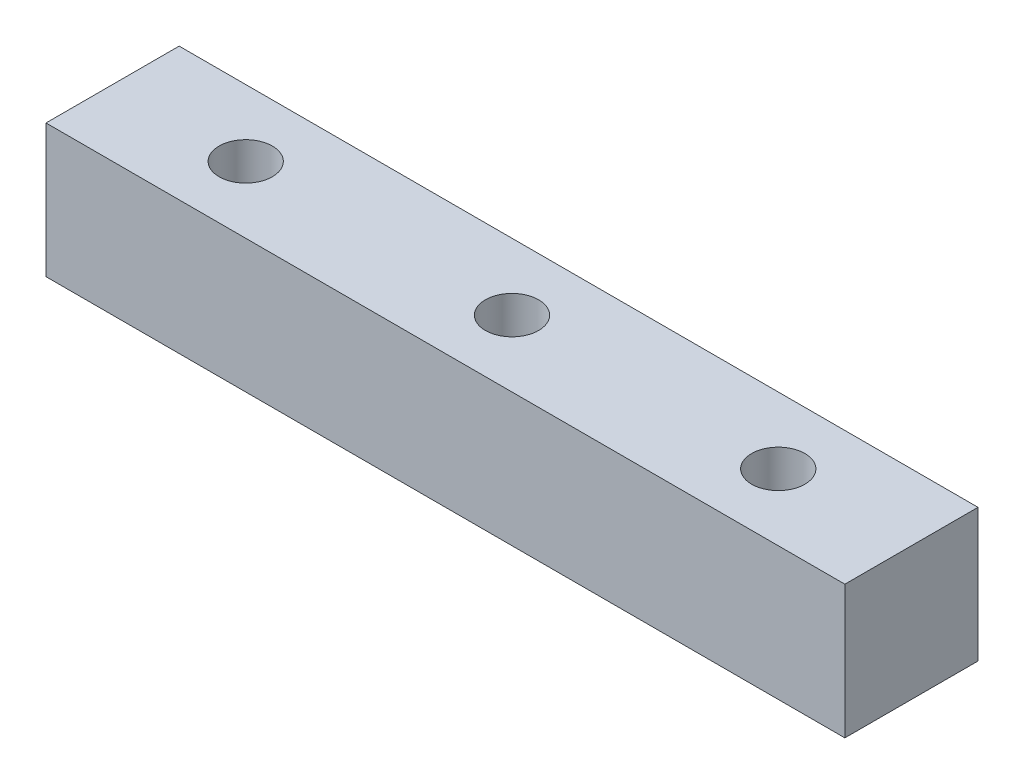
ISO-10303-21;
HEADER;
FILE_DESCRIPTION(('STEP AP214'),'2;1');
FILE_NAME('part.step','',(''),(''),'','','');
FILE_SCHEMA(('AUTOMOTIVE_DESIGN { 1 0 10303 214 1 1 1 1 }'));
ENDSEC;
DATA;
#1=APPLICATION_CONTEXT('core data for automotive mechanical design processes');
#2=APPLICATION_PROTOCOL_DEFINITION('international standard','automotive_design',2000,#1);
#3=PRODUCT_CONTEXT('',#1,'mechanical');
#4=PRODUCT('Part','Part','',(#3));
#5=PRODUCT_RELATED_PRODUCT_CATEGORY('part','',(#4));
#6=PRODUCT_DEFINITION_FORMATION('','',#4);
#7=PRODUCT_DEFINITION_CONTEXT('part definition',#1,'design');
#8=PRODUCT_DEFINITION('design','',#6,#7);
#9=PRODUCT_DEFINITION_SHAPE('','',#8);
#10=(LENGTH_UNIT() NAMED_UNIT(*) SI_UNIT(.MILLI.,.METRE.));
#11=(NAMED_UNIT(*) PLANE_ANGLE_UNIT() SI_UNIT($,.RADIAN.));
#12=(NAMED_UNIT(*) SI_UNIT($,.STERADIAN.) SOLID_ANGLE_UNIT());
#13=UNCERTAINTY_MEASURE_WITH_UNIT(LENGTH_MEASURE(1.E-05),#10,'distance_accuracy_value','');
#14=(GEOMETRIC_REPRESENTATION_CONTEXT(3) GLOBAL_UNCERTAINTY_ASSIGNED_CONTEXT((#13)) GLOBAL_UNIT_ASSIGNED_CONTEXT((#10,
#11,#12)) REPRESENTATION_CONTEXT('',''));
#15=CARTESIAN_POINT('',(0.,0.,0.));
#16=DIRECTION('',(0.,0.,1.));
#17=DIRECTION('',(1.,0.,0.));
#18=AXIS2_PLACEMENT_3D('',#15,#16,#17);
#19=CARTESIAN_POINT('',(0.,10.,0.));
#20=DIRECTION('',(0.,-1.,0.));
#21=DIRECTION('',(0.,0.,-1.));
#22=AXIS2_PLACEMENT_3D('',#19,#20,#21);
#23=PLANE('',#22);
#24=DIRECTION('',(0.,0.,1.));
#25=VECTOR('',#24,1.);
#26=CARTESIAN_POINT('',(0.,10.,0.));
#27=LINE('',#26,#25);
#28=CARTESIAN_POINT('',(0.,10.,-10.));
#29=VERTEX_POINT('',#28);
#30=CARTESIAN_POINT('',(0.,10.,0.));
#31=VERTEX_POINT('',#30);
#32=EDGE_CURVE('E85',#29,#31,#27,.T.);
#33=ORIENTED_EDGE('',*,*,#32,.T.);
#34=DIRECTION('',(1.,0.,0.));
#35=VECTOR('',#34,1.);
#36=CARTESIAN_POINT('',(0.,10.,0.));
#37=LINE('',#36,#35);
#38=CARTESIAN_POINT('',(60.,10.,0.));
#39=VERTEX_POINT('',#38);
#40=EDGE_CURVE('E80',#31,#39,#37,.T.);
#41=ORIENTED_EDGE('',*,*,#40,.T.);
#42=DIRECTION('',(0.,0.,-1.));
#43=VECTOR('',#42,1.);
#44=CARTESIAN_POINT('',(60.,10.,0.));
#45=LINE('',#44,#43);
#46=CARTESIAN_POINT('',(60.,10.,-10.));
#47=VERTEX_POINT('',#46);
#48=EDGE_CURVE('E83',#39,#47,#45,.T.);
#49=ORIENTED_EDGE('',*,*,#48,.T.);
#50=DIRECTION('',(-1.,0.,0.));
#51=VECTOR('',#50,1.);
#52=CARTESIAN_POINT('',(0.,10.,-10.));
#53=LINE('',#52,#51);
#54=EDGE_CURVE('E50',#47,#29,#53,.T.);
#55=ORIENTED_EDGE('',*,*,#54,.T.);
#56=EDGE_LOOP('',(#33,#41,#49,#55));
#57=FACE_BOUND('',#56,.T.);
#58=CARTESIAN_POINT('',(10.,10.,-5.));
#59=DIRECTION('',(0.,1.,0.));
#60=DIRECTION('',(0.,0.,1.));
#61=AXIS2_PLACEMENT_3D('',#58,#59,#60);
#62=CIRCLE('',#61,2.);
#63=CARTESIAN_POINT('',(10.,10.,-3.));
#64=VERTEX_POINT('',#63);
#65=EDGE_CURVE('E100',#64,#64,#62,.T.);
#66=ORIENTED_EDGE('',*,*,#65,.F.);
#67=EDGE_LOOP('',(#66));
#68=FACE_BOUND('',#67,.T.);
#69=CARTESIAN_POINT('',(30.,10.,-5.));
#70=DIRECTION('',(0.,1.,0.));
#71=DIRECTION('',(0.,0.,1.));
#72=AXIS2_PLACEMENT_3D('',#69,#70,#71);
#73=CIRCLE('',#72,2.);
#74=CARTESIAN_POINT('',(30.,10.,-3.));
#75=VERTEX_POINT('',#74);
#76=EDGE_CURVE('E115',#75,#75,#73,.T.);
#77=ORIENTED_EDGE('',*,*,#76,.F.);
#78=EDGE_LOOP('',(#77));
#79=FACE_BOUND('',#78,.T.);
#80=CARTESIAN_POINT('',(50.,10.,-5.));
#81=DIRECTION('',(0.,1.,0.));
#82=DIRECTION('',(0.,0.,1.));
#83=AXIS2_PLACEMENT_3D('',#80,#81,#82);
#84=CIRCLE('',#83,2.);
#85=CARTESIAN_POINT('',(50.,10.,-3.));
#86=VERTEX_POINT('',#85);
#87=EDGE_CURVE('E121',#86,#86,#84,.T.);
#88=ORIENTED_EDGE('',*,*,#87,.F.);
#89=EDGE_LOOP('',(#88));
#90=FACE_BOUND('',#89,.T.);
#91=ADVANCED_FACE('F33',(#57,#68,#79,#90),#23,.F.);
#92=CARTESIAN_POINT('',(0.,0.,0.));
#93=DIRECTION('',(0.,-1.,0.));
#94=DIRECTION('',(0.,0.,-1.));
#95=AXIS2_PLACEMENT_3D('',#92,#93,#94);
#96=PLANE('',#95);
#97=CARTESIAN_POINT('',(30.,0.,-5.));
#98=DIRECTION('',(0.,1.,0.));
#99=DIRECTION('',(0.,0.,1.));
#100=AXIS2_PLACEMENT_3D('',#97,#98,#99);
#101=CIRCLE('',#100,2.);
#102=CARTESIAN_POINT('',(30.,0.,-3.));
#103=VERTEX_POINT('',#102);
#104=EDGE_CURVE('E118',#103,#103,#101,.T.);
#105=ORIENTED_EDGE('',*,*,#104,.T.);
#106=EDGE_LOOP('',(#105));
#107=FACE_BOUND('',#106,.T.);
#108=DIRECTION('',(0.,0.,1.));
#109=VECTOR('',#108,1.);
#110=CARTESIAN_POINT('',(0.,0.,0.));
#111=LINE('',#110,#109);
#112=CARTESIAN_POINT('',(0.,0.,-10.));
#113=VERTEX_POINT('',#112);
#114=CARTESIAN_POINT('',(0.,0.,0.));
#115=VERTEX_POINT('',#114);
#116=EDGE_CURVE('E97',#113,#115,#111,.T.);
#117=ORIENTED_EDGE('',*,*,#116,.F.);
#118=DIRECTION('',(-1.,0.,0.));
#119=VECTOR('',#118,1.);
#120=CARTESIAN_POINT('',(0.,0.,-10.));
#121=LINE('',#120,#119);
#122=CARTESIAN_POINT('',(60.,0.,-10.));
#123=VERTEX_POINT('',#122);
#124=EDGE_CURVE('E73',#123,#113,#121,.T.);
#125=ORIENTED_EDGE('',*,*,#124,.F.);
#126=DIRECTION('',(0.,0.,-1.));
#127=VECTOR('',#126,1.);
#128=CARTESIAN_POINT('',(60.,0.,0.));
#129=LINE('',#128,#127);
#130=CARTESIAN_POINT('',(60.,0.,0.));
#131=VERTEX_POINT('',#130);
#132=EDGE_CURVE('E67',#131,#123,#129,.T.);
#133=ORIENTED_EDGE('',*,*,#132,.F.);
#134=DIRECTION('',(1.,0.,0.));
#135=VECTOR('',#134,1.);
#136=CARTESIAN_POINT('',(0.,0.,0.));
#137=LINE('',#136,#135);
#138=EDGE_CURVE('E89',#115,#131,#137,.T.);
#139=ORIENTED_EDGE('',*,*,#138,.F.);
#140=EDGE_LOOP('',(#117,#125,#133,#139));
#141=FACE_BOUND('',#140,.T.);
#142=CARTESIAN_POINT('',(10.,0.,-5.));
#143=DIRECTION('',(0.,1.,0.));
#144=DIRECTION('',(0.,0.,1.));
#145=AXIS2_PLACEMENT_3D('',#142,#143,#144);
#146=CIRCLE('',#145,2.);
#147=CARTESIAN_POINT('',(10.,0.,-3.));
#148=VERTEX_POINT('',#147);
#149=EDGE_CURVE('E112',#148,#148,#146,.T.);
#150=ORIENTED_EDGE('',*,*,#149,.T.);
#151=EDGE_LOOP('',(#150));
#152=FACE_BOUND('',#151,.T.);
#153=CARTESIAN_POINT('',(50.,0.,-5.));
#154=DIRECTION('',(0.,1.,0.));
#155=DIRECTION('',(0.,0.,1.));
#156=AXIS2_PLACEMENT_3D('',#153,#154,#155);
#157=CIRCLE('',#156,2.);
#158=CARTESIAN_POINT('',(50.,0.,-3.));
#159=VERTEX_POINT('',#158);
#160=EDGE_CURVE('E124',#159,#159,#157,.T.);
#161=ORIENTED_EDGE('',*,*,#160,.T.);
#162=EDGE_LOOP('',(#161));
#163=FACE_BOUND('',#162,.T.);
#164=ADVANCED_FACE('F108',(#107,#141,#152,#163),#96,.T.);
#165=CARTESIAN_POINT('',(0.,10.,0.));
#166=DIRECTION('',(1.,0.,0.));
#167=DIRECTION('',(0.,0.,-1.));
#168=AXIS2_PLACEMENT_3D('',#165,#166,#167);
#169=PLANE('',#168);
#170=ORIENTED_EDGE('',*,*,#116,.T.);
#171=DIRECTION('',(0.,-1.,0.));
#172=VECTOR('',#171,1.);
#173=CARTESIAN_POINT('',(0.,10.,0.));
#174=LINE('',#173,#172);
#175=EDGE_CURVE('E11',#31,#115,#174,.T.);
#176=ORIENTED_EDGE('',*,*,#175,.F.);
#177=ORIENTED_EDGE('',*,*,#32,.F.);
#178=DIRECTION('',(0.,-1.,0.));
#179=VECTOR('',#178,1.);
#180=CARTESIAN_POINT('',(0.,10.,-10.));
#181=LINE('',#180,#179);
#182=EDGE_CURVE('E93',#29,#113,#181,.T.);
#183=ORIENTED_EDGE('',*,*,#182,.T.);
#184=EDGE_LOOP('',(#170,#176,#177,#183));
#185=FACE_BOUND('',#184,.T.);
#186=ADVANCED_FACE('F35',(#185),#169,.F.);
#187=CARTESIAN_POINT('',(0.,10.,0.));
#188=DIRECTION('',(0.,0.,-1.));
#189=DIRECTION('',(-1.,0.,0.));
#190=AXIS2_PLACEMENT_3D('',#187,#188,#189);
#191=PLANE('',#190);
#192=ORIENTED_EDGE('',*,*,#138,.T.);
#193=DIRECTION('',(0.,-1.,0.));
#194=VECTOR('',#193,1.);
#195=CARTESIAN_POINT('',(60.,10.,0.));
#196=LINE('',#195,#194);
#197=EDGE_CURVE('E42',#39,#131,#196,.T.);
#198=ORIENTED_EDGE('',*,*,#197,.F.);
#199=ORIENTED_EDGE('',*,*,#40,.F.);
#200=ORIENTED_EDGE('',*,*,#175,.T.);
#201=EDGE_LOOP('',(#192,#198,#199,#200));
#202=FACE_BOUND('',#201,.T.);
#203=ADVANCED_FACE('F88',(#202),#191,.F.);
#204=CARTESIAN_POINT('',(60.,10.,0.));
#205=DIRECTION('',(-1.,0.,0.));
#206=DIRECTION('',(0.,0.,1.));
#207=AXIS2_PLACEMENT_3D('',#204,#205,#206);
#208=PLANE('',#207);
#209=ORIENTED_EDGE('',*,*,#132,.T.);
#210=DIRECTION('',(0.,-1.,0.));
#211=VECTOR('',#210,1.);
#212=CARTESIAN_POINT('',(60.,10.,-10.));
#213=LINE('',#212,#211);
#214=EDGE_CURVE('E90',#47,#123,#213,.T.);
#215=ORIENTED_EDGE('',*,*,#214,.F.);
#216=ORIENTED_EDGE('',*,*,#48,.F.);
#217=ORIENTED_EDGE('',*,*,#197,.T.);
#218=EDGE_LOOP('',(#209,#215,#216,#217));
#219=FACE_BOUND('',#218,.T.);
#220=ADVANCED_FACE('F91',(#219),#208,.F.);
#221=CARTESIAN_POINT('',(0.,10.,-10.));
#222=DIRECTION('',(0.,0.,1.));
#223=DIRECTION('',(1.,0.,0.));
#224=AXIS2_PLACEMENT_3D('',#221,#222,#223);
#225=PLANE('',#224);
#226=ORIENTED_EDGE('',*,*,#124,.T.);
#227=ORIENTED_EDGE('',*,*,#182,.F.);
#228=ORIENTED_EDGE('',*,*,#54,.F.);
#229=ORIENTED_EDGE('',*,*,#214,.T.);
#230=EDGE_LOOP('',(#226,#227,#228,#229));
#231=FACE_BOUND('',#230,.T.);
#232=ADVANCED_FACE('F105',(#231),#225,.F.);
#233=CARTESIAN_POINT('',(10.,10.,-5.));
#234=DIRECTION('',(0.,-1.,0.));
#235=DIRECTION('',(0.,0.,-1.));
#236=AXIS2_PLACEMENT_3D('',#233,#234,#235);
#237=CYLINDRICAL_SURFACE('',#236,2.);
#238=ORIENTED_EDGE('',*,*,#65,.T.);
#239=EDGE_LOOP('',(#238));
#240=FACE_BOUND('',#239,.T.);
#241=ORIENTED_EDGE('',*,*,#149,.F.);
#242=EDGE_LOOP('',(#241));
#243=FACE_BOUND('',#242,.T.);
#244=ADVANCED_FACE('F141',(#240,#243),#237,.F.);
#245=CARTESIAN_POINT('',(30.,10.,-5.));
#246=DIRECTION('',(0.,-1.,0.));
#247=DIRECTION('',(0.,0.,-1.));
#248=AXIS2_PLACEMENT_3D('',#245,#246,#247);
#249=CYLINDRICAL_SURFACE('',#248,2.);
#250=ORIENTED_EDGE('',*,*,#76,.T.);
#251=EDGE_LOOP('',(#250));
#252=FACE_BOUND('',#251,.T.);
#253=ORIENTED_EDGE('',*,*,#104,.F.);
#254=EDGE_LOOP('',(#253));
#255=FACE_BOUND('',#254,.T.);
#256=ADVANCED_FACE('F187',(#252,#255),#249,.F.);
#257=CARTESIAN_POINT('',(50.,10.,-5.));
#258=DIRECTION('',(0.,-1.,0.));
#259=DIRECTION('',(0.,0.,-1.));
#260=AXIS2_PLACEMENT_3D('',#257,#258,#259);
#261=CYLINDRICAL_SURFACE('',#260,2.);
#262=ORIENTED_EDGE('',*,*,#87,.T.);
#263=EDGE_LOOP('',(#262));
#264=FACE_BOUND('',#263,.T.);
#265=ORIENTED_EDGE('',*,*,#160,.F.);
#266=EDGE_LOOP('',(#265));
#267=FACE_BOUND('',#266,.T.);
#268=ADVANCED_FACE('F130',(#264,#267),#261,.F.);
#269=CLOSED_SHELL('',(#91,#164,#186,#203,#220,#232,#244,#256,#268));
#270=MANIFOLD_SOLID_BREP('B2',#269);
#271=ADVANCED_BREP_SHAPE_REPRESENTATION('',(#18,#270),#14);
#272=SHAPE_DEFINITION_REPRESENTATION(#9,#271);
ENDSEC;
END-ISO-10303-21;
